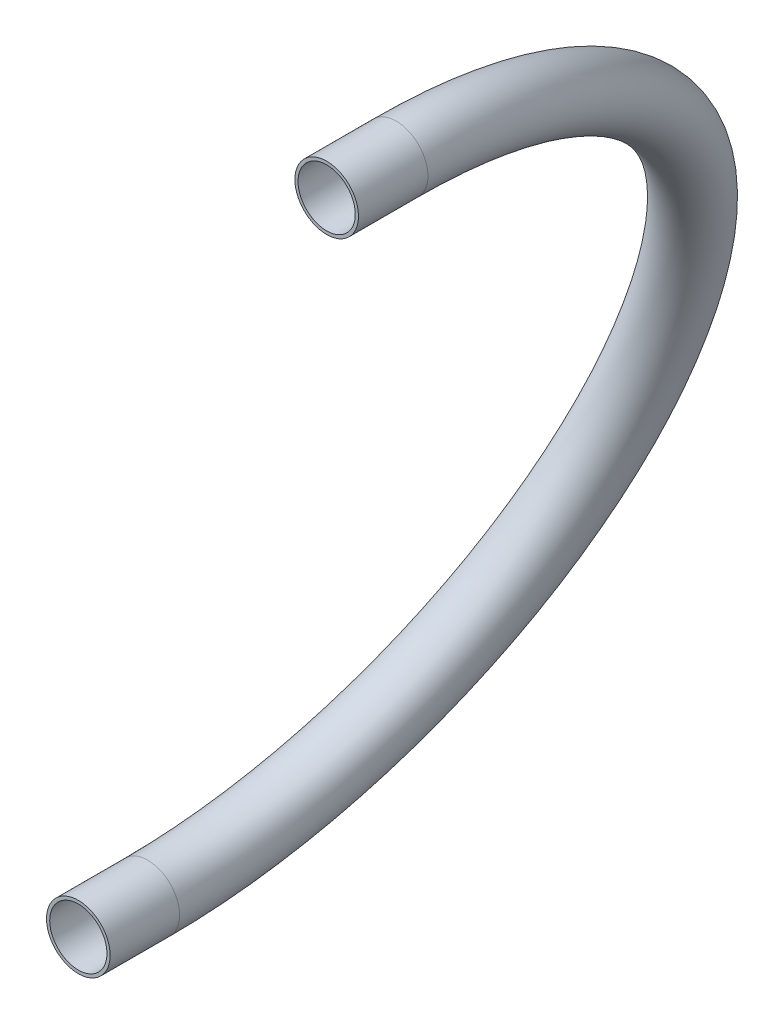
ISO-10303-21;
HEADER;
FILE_DESCRIPTION(('STEP AP214'),'2;1');
FILE_NAME('part.step','',(''),(''),'','','');
FILE_SCHEMA(('AUTOMOTIVE_DESIGN { 1 0 10303 214 1 1 1 1 }'));
ENDSEC;
DATA;
#1=APPLICATION_CONTEXT('core data for automotive mechanical design processes');
#2=APPLICATION_PROTOCOL_DEFINITION('international standard','automotive_design',2000,#1);
#3=PRODUCT_CONTEXT('',#1,'mechanical');
#4=PRODUCT('Part','Part','',(#3));
#5=PRODUCT_RELATED_PRODUCT_CATEGORY('part','',(#4));
#6=PRODUCT_DEFINITION_FORMATION('','',#4);
#7=PRODUCT_DEFINITION_CONTEXT('part definition',#1,'design');
#8=PRODUCT_DEFINITION('design','',#6,#7);
#9=PRODUCT_DEFINITION_SHAPE('','',#8);
#10=(LENGTH_UNIT() NAMED_UNIT(*) SI_UNIT(.MILLI.,.METRE.));
#11=(NAMED_UNIT(*) PLANE_ANGLE_UNIT() SI_UNIT($,.RADIAN.));
#12=(NAMED_UNIT(*) SI_UNIT($,.STERADIAN.) SOLID_ANGLE_UNIT());
#13=UNCERTAINTY_MEASURE_WITH_UNIT(LENGTH_MEASURE(1.E-05),#10,'distance_accuracy_value','');
#14=(GEOMETRIC_REPRESENTATION_CONTEXT(3) GLOBAL_UNCERTAINTY_ASSIGNED_CONTEXT((#13)) GLOBAL_UNIT_ASSIGNED_CONTEXT((#10,
#11,#12)) REPRESENTATION_CONTEXT('',''));
#15=CARTESIAN_POINT('',(0.,0.,0.));
#16=DIRECTION('',(0.,0.,1.));
#17=DIRECTION('',(1.,0.,0.));
#18=AXIS2_PLACEMENT_3D('',#15,#16,#17);
#19=CARTESIAN_POINT('',(19.9948107662619,-82.4442238405375,-42.9619337826916));
#20=DIRECTION('',(0.,0.,-1.));
#21=DIRECTION('',(0.,1.,0.));
#22=AXIS2_PLACEMENT_3D('',#19,#20,#21);
#23=CYLINDRICAL_SURFACE('',#22,2.1844383495845);
#24=CARTESIAN_POINT('',(19.9948107662619,-82.4442238405375,-47.7352452462186));
#25=DIRECTION('',(0.,0.,-1.));
#26=DIRECTION('',(-1.,0.,0.));
#27=AXIS2_PLACEMENT_3D('',#24,#25,#26);
#28=CIRCLE('',#27,2.1844383495845);
#29=CARTESIAN_POINT('',(19.319782193076,-84.5217481673547,-47.7352452462186));
#30=VERTEX_POINT('',#29);
#31=EDGE_CURVE('E62',#30,#30,#28,.T.);
#32=ORIENTED_EDGE('',*,*,#31,.F.);
#33=EDGE_LOOP('',(#32));
#34=FACE_BOUND('',#33,.T.);
#35=CARTESIAN_POINT('',(19.9948107662619,-82.4442238405375,-42.9619337826916));
#36=DIRECTION('',(0.,0.,-1.));
#37=DIRECTION('',(-1.,0.,0.));
#38=AXIS2_PLACEMENT_3D('',#35,#36,#37);
#39=CIRCLE('',#38,2.1844383495845);
#40=CARTESIAN_POINT('',(17.8103724166774,-82.4442238405375,-42.9619337826916));
#41=VERTEX_POINT('',#40);
#42=EDGE_CURVE('E60',#41,#41,#39,.T.);
#43=ORIENTED_EDGE('',*,*,#42,.T.);
#44=EDGE_LOOP('',(#43));
#45=FACE_BOUND('',#44,.T.);
#46=ADVANCED_FACE('F39',(#34,#45),#23,.T.);
#47=CARTESIAN_POINT('',(28.525564979782,-56.1892620378972,-47.7352452462186));
#48=DIRECTION('',(0.951056516295157,-0.309016994374937,0.));
#49=DIRECTION('',(0.309016994374937,0.951056516295157,0.));
#50=AXIS2_PLACEMENT_3D('',#47,#48,#49);
#51=TOROIDAL_SURFACE('',#50,27.6061005342947,2.1844383495845);
#52=CARTESIAN_POINT('',(37.0563191933022,-29.9343002352569,-47.7352452462186));
#53=DIRECTION('',(0.,0.,1.));
#54=DIRECTION('',(-0.80901699437496,0.587785252292456,0.));
#55=AXIS2_PLACEMENT_3D('',#52,#53,#54);
#56=CIRCLE('',#55,2.1844383495845);
#57=CARTESIAN_POINT('',(37.7313477664881,-27.8567759084397,-47.7352452462186));
#58=VERTEX_POINT('',#57);
#59=EDGE_CURVE('E43',#58,#58,#56,.T.);
#60=CARTESIAN_POINT('',(28.525564979782,-56.1892620378972,-47.7352452462186));
#61=DIRECTION('',(0.951056516295157,-0.309016994374937,0.));
#62=DIRECTION('',(0.309016994374937,0.951056516295157,0.));
#63=AXIS2_PLACEMENT_3D('',#60,#61,#62);
#64=CIRCLE('',#63,29.7905388838792);
#65=EDGE_CURVE('',#30,#58,#64,.T.);
#66=ORIENTED_EDGE('',*,*,#31,.T.);
#67=ORIENTED_EDGE('',*,*,#59,.F.);
#68=ORIENTED_EDGE('',*,*,#65,.T.);
#69=ORIENTED_EDGE('',*,*,#65,.F.);
#70=EDGE_LOOP('',(#66,#68,#67,#69));
#71=FACE_BOUND('',#70,.T.);
#72=ADVANCED_FACE('F70',(#71),#51,.T.);
#73=CARTESIAN_POINT('',(37.0563191933022,-29.9343002352569,-47.7352452462186));
#74=DIRECTION('',(0.,0.,1.));
#75=DIRECTION('',(0.,-1.,0.));
#76=AXIS2_PLACEMENT_3D('',#73,#74,#75);
#77=CYLINDRICAL_SURFACE('',#76,2.1844383495845);
#78=CARTESIAN_POINT('',(37.0563191933022,-29.9343002352569,-42.9619337826916));
#79=DIRECTION('',(0.,0.,1.));
#80=DIRECTION('',(-0.80901699437496,0.587785252292456,0.));
#81=AXIS2_PLACEMENT_3D('',#78,#79,#80);
#82=CIRCLE('',#81,2.1844383495845);
#83=CARTESIAN_POINT('',(35.2890714453239,-28.6503195888291,-42.9619337826916));
#84=VERTEX_POINT('',#83);
#85=EDGE_CURVE('E56',#84,#84,#82,.T.);
#86=ORIENTED_EDGE('',*,*,#85,.F.);
#87=EDGE_LOOP('',(#86));
#88=FACE_BOUND('',#87,.T.);
#89=ORIENTED_EDGE('',*,*,#59,.T.);
#90=EDGE_LOOP('',(#89));
#91=FACE_BOUND('',#90,.T.);
#92=ADVANCED_FACE('F41',(#88,#91),#77,.T.);
#93=CARTESIAN_POINT('',(19.9948107662619,-82.4442238405375,-42.9619337826916));
#94=DIRECTION('',(0.,0.,-1.));
#95=DIRECTION('',(-1.,0.,0.));
#96=AXIS2_PLACEMENT_3D('',#93,#94,#95);
#97=PLANE('',#96);
#98=CARTESIAN_POINT('',(19.9948107662619,-82.4442238405375,-42.9619337826916));
#99=DIRECTION('',(0.,0.,-1.));
#100=DIRECTION('',(-1.,0.,0.));
#101=AXIS2_PLACEMENT_3D('',#98,#99,#100);
#102=CIRCLE('',#101,1.96630346989101);
#103=CARTESIAN_POINT('',(18.0285072963709,-82.4442238405375,-42.9619337826916));
#104=VERTEX_POINT('',#103);
#105=EDGE_CURVE('E59',#104,#104,#102,.F.);
#106=ORIENTED_EDGE('',*,*,#105,.F.);
#107=EDGE_LOOP('',(#106));
#108=FACE_BOUND('',#107,.T.);
#109=ORIENTED_EDGE('',*,*,#42,.F.);
#110=EDGE_LOOP('',(#109));
#111=FACE_BOUND('',#110,.T.);
#112=ADVANCED_FACE('F76',(#108,#111),#97,.F.);
#113=CARTESIAN_POINT('',(37.0563191933022,-29.9343002352569,-42.9619337826916));
#114=DIRECTION('',(0.,0.,1.));
#115=DIRECTION('',(-0.80901699437496,0.587785252292456,0.));
#116=AXIS2_PLACEMENT_3D('',#113,#114,#115);
#117=PLANE('',#116);
#118=CARTESIAN_POINT('',(37.0563191933022,-29.9343002352569,-42.9619337826916));
#119=DIRECTION('',(0.,0.,1.));
#120=DIRECTION('',(-0.80901699437496,0.587785252292456,0.));
#121=AXIS2_PLACEMENT_3D('',#118,#119,#120);
#122=CIRCLE('',#121,1.96630346989101);
#123=CARTESIAN_POINT('',(35.4655462700619,-28.7785360541235,-42.9619337826916));
#124=VERTEX_POINT('',#123);
#125=EDGE_CURVE('E10',#124,#124,#122,.F.);
#126=ORIENTED_EDGE('',*,*,#125,.T.);
#127=EDGE_LOOP('',(#126));
#128=FACE_BOUND('',#127,.T.);
#129=ORIENTED_EDGE('',*,*,#85,.T.);
#130=EDGE_LOOP('',(#129));
#131=FACE_BOUND('',#130,.T.);
#132=ADVANCED_FACE('F94',(#128,#131),#117,.T.);
#133=CARTESIAN_POINT('',(19.9948107662619,-82.4442238405375,-42.9619337826916));
#134=DIRECTION('',(0.,0.,-1.));
#135=DIRECTION('',(0.,1.,0.));
#136=AXIS2_PLACEMENT_3D('',#133,#134,#135);
#137=CYLINDRICAL_SURFACE('',#136,1.96630346989101);
#138=CARTESIAN_POINT('',(19.9948107662619,-82.4442238405375,-47.7352452462186));
#139=DIRECTION('',(0.,0.,-1.));
#140=DIRECTION('',(-1.,0.,0.));
#141=AXIS2_PLACEMENT_3D('',#138,#139,#140);
#142=CIRCLE('',#141,1.96630346989101);
#143=CARTESIAN_POINT('',(19.3871895779672,-84.314289568591,-47.7352452462186));
#144=VERTEX_POINT('',#143);
#145=EDGE_CURVE('E52',#144,#144,#142,.F.);
#146=ORIENTED_EDGE('',*,*,#145,.F.);
#147=EDGE_LOOP('',(#146));
#148=FACE_BOUND('',#147,.T.);
#149=ORIENTED_EDGE('',*,*,#105,.T.);
#150=EDGE_LOOP('',(#149));
#151=FACE_BOUND('',#150,.T.);
#152=ADVANCED_FACE('F88',(#148,#151),#137,.F.);
#153=CARTESIAN_POINT('',(28.525564979782,-56.1892620378972,-47.7352452462186));
#154=DIRECTION('',(0.951056516295157,-0.309016994374937,0.));
#155=DIRECTION('',(0.309016994374937,0.951056516295157,0.));
#156=AXIS2_PLACEMENT_3D('',#153,#154,#155);
#157=TOROIDAL_SURFACE('',#156,27.6061005342947,1.96630346989101);
#158=CARTESIAN_POINT('',(37.0563191933022,-29.9343002352569,-47.7352452462186));
#159=DIRECTION('',(0.,0.,1.));
#160=DIRECTION('',(-0.80901699437496,0.587785252292456,0.));
#161=AXIS2_PLACEMENT_3D('',#158,#159,#160);
#162=CIRCLE('',#161,1.96630346989101);
#163=CARTESIAN_POINT('',(37.6639403815969,-28.0642345072035,-47.7352452462186));
#164=VERTEX_POINT('',#163);
#165=EDGE_CURVE('E47',#164,#164,#162,.F.);
#166=CARTESIAN_POINT('',(28.525564979782,-56.1892620378972,-47.7352452462186));
#167=DIRECTION('',(0.951056516295157,-0.309016994374937,0.));
#168=DIRECTION('',(0.309016994374937,0.951056516295157,0.));
#169=AXIS2_PLACEMENT_3D('',#166,#167,#168);
#170=CIRCLE('',#169,29.5724040041857);
#171=EDGE_CURVE('',#144,#164,#170,.T.);
#172=ORIENTED_EDGE('',*,*,#145,.T.);
#173=ORIENTED_EDGE('',*,*,#165,.F.);
#174=ORIENTED_EDGE('',*,*,#171,.T.);
#175=ORIENTED_EDGE('',*,*,#171,.F.);
#176=EDGE_LOOP('',(#172,#174,#173,#175));
#177=FACE_BOUND('',#176,.T.);
#178=ADVANCED_FACE('F82',(#177),#157,.F.);
#179=CARTESIAN_POINT('',(37.0563191933022,-29.9343002352569,-47.7352452462186));
#180=DIRECTION('',(0.,0.,1.));
#181=DIRECTION('',(0.,-1.,0.));
#182=AXIS2_PLACEMENT_3D('',#179,#180,#181);
#183=CYLINDRICAL_SURFACE('',#182,1.96630346989101);
#184=ORIENTED_EDGE('',*,*,#125,.F.);
#185=EDGE_LOOP('',(#184));
#186=FACE_BOUND('',#185,.T.);
#187=ORIENTED_EDGE('',*,*,#165,.T.);
#188=EDGE_LOOP('',(#187));
#189=FACE_BOUND('',#188,.T.);
#190=ADVANCED_FACE('F80',(#186,#189),#183,.F.);
#191=CLOSED_SHELL('',(#46,#72,#92,#112,#132,#152,#178,#190));
#192=MANIFOLD_SOLID_BREP('B2',#191);
#193=ADVANCED_BREP_SHAPE_REPRESENTATION('',(#18,#192),#14);
#194=SHAPE_DEFINITION_REPRESENTATION(#9,#193);
ENDSEC;
END-ISO-10303-21;
